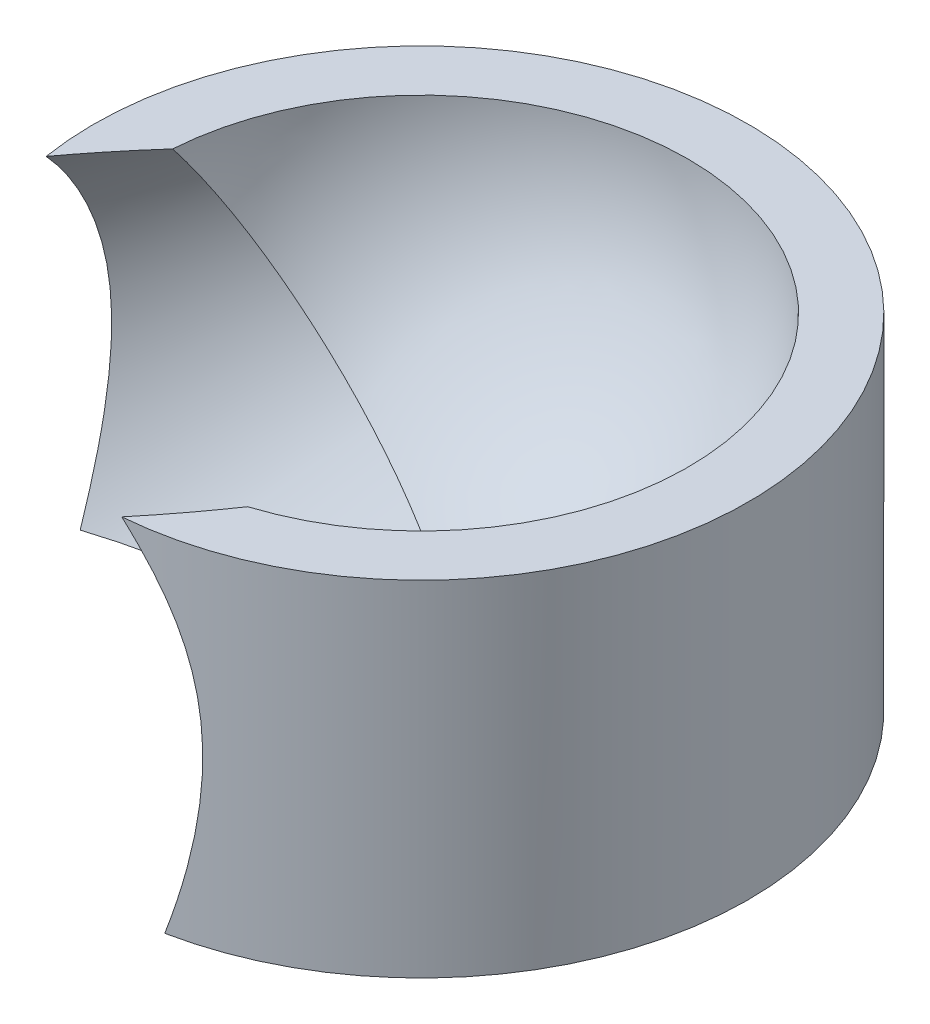
ISO-10303-21;
HEADER;
FILE_DESCRIPTION(('STEP AP214'),'2;1');
FILE_NAME('part.step','',(''),(''),'','','');
FILE_SCHEMA(('AUTOMOTIVE_DESIGN { 1 0 10303 214 1 1 1 1 }'));
ENDSEC;
DATA;
#1=APPLICATION_CONTEXT('core data for automotive mechanical design processes');
#2=APPLICATION_PROTOCOL_DEFINITION('international standard','automotive_design',2000,#1);
#3=PRODUCT_CONTEXT('',#1,'mechanical');
#4=PRODUCT('Part','Part','',(#3));
#5=PRODUCT_RELATED_PRODUCT_CATEGORY('part','',(#4));
#6=PRODUCT_DEFINITION_FORMATION('','',#4);
#7=PRODUCT_DEFINITION_CONTEXT('part definition',#1,'design');
#8=PRODUCT_DEFINITION('design','',#6,#7);
#9=PRODUCT_DEFINITION_SHAPE('','',#8);
#10=(LENGTH_UNIT() NAMED_UNIT(*) SI_UNIT(.MILLI.,.METRE.));
#11=(NAMED_UNIT(*) PLANE_ANGLE_UNIT() SI_UNIT($,.RADIAN.));
#12=(NAMED_UNIT(*) SI_UNIT($,.STERADIAN.) SOLID_ANGLE_UNIT());
#13=UNCERTAINTY_MEASURE_WITH_UNIT(LENGTH_MEASURE(1.E-05),#10,'distance_accuracy_value','');
#14=(GEOMETRIC_REPRESENTATION_CONTEXT(3) GLOBAL_UNCERTAINTY_ASSIGNED_CONTEXT((#13)) GLOBAL_UNIT_ASSIGNED_CONTEXT((#10,
#11,#12)) REPRESENTATION_CONTEXT('',''));
#15=CARTESIAN_POINT('',(0.,0.,0.));
#16=DIRECTION('',(0.,0.,1.));
#17=DIRECTION('',(1.,0.,0.));
#18=AXIS2_PLACEMENT_3D('',#15,#16,#17);
#19=CARTESIAN_POINT('',(-30.3108891324554,97.7,-15.));
#20=DIRECTION('',(0.,-1.,0.));
#21=DIRECTION('',(0.,0.,1.));
#22=AXIS2_PLACEMENT_3D('',#19,#20,#21);
#23=CYLINDRICAL_SURFACE('',#22,3.8);
#24=CARTESIAN_POINT('',(-30.3108891324554,97.,-15.));
#25=DIRECTION('',(0.,-1.,0.));
#26=DIRECTION('',(0.,0.,-1.));
#27=AXIS2_PLACEMENT_3D('',#24,#25,#26);
#28=CIRCLE('',#27,3.8);
#29=CARTESIAN_POINT('',(-34.1074748867385,97.,-14.8389515278731));
#30=VERTEX_POINT('',#29);
#31=CARTESIAN_POINT('',(-29.5615041608978,97.,-11.2746245606109));
#32=VERTEX_POINT('',#31);
#33=EDGE_CURVE('E47',#30,#32,#28,.T.);
#34=ORIENTED_EDGE('',*,*,#33,.F.);
#35=CARTESIAN_POINT('',(-34.0630424960343,101.0002,-14.3988800983306));
#36=CARTESIAN_POINT('',(-34.0718110950236,100.941314470494,-14.4535727451348));
#37=CARTESIAN_POINT('',(-34.0790221760432,100.880334472737,-14.5062811678693));
#38=CARTESIAN_POINT('',(-34.0908557219644,100.754374278326,-14.6070441904282));
#39=CARTESIAN_POINT('',(-34.0954772635486,100.689392664025,-14.655097125263));
#40=CARTESIAN_POINT('',(-34.1026321593722,100.556042110918,-14.7455647480082));
#41=CARTESIAN_POINT('',(-34.1051772884519,100.487694636403,-14.7880100685159));
#42=CARTESIAN_POINT('',(-34.1087664887118,100.347645833791,-14.8669930394829));
#43=CARTESIAN_POINT('',(-34.1098108736453,100.275945209957,-14.9035319233538));
#44=CARTESIAN_POINT('',(-34.1109217529916,100.129422236479,-14.970402087824));
#45=CARTESIAN_POINT('',(-34.1109851278273,100.054590686642,-15.0007132631708));
#46=CARTESIAN_POINT('',(-34.1105903971042,99.9025749564758,-15.0547990580072));
#47=CARTESIAN_POINT('',(-34.1101320842451,99.8253898527917,-15.0785710744027));
#48=CARTESIAN_POINT('',(-34.1090618616021,99.6693551529714,-15.1196080622126));
#49=CARTESIAN_POINT('',(-34.1084500210118,99.5905063212864,-15.1368759562337));
#50=CARTESIAN_POINT('',(-34.1073225352008,99.4316928256814,-15.1652013652592));
#51=CARTESIAN_POINT('',(-34.1068069187919,99.3517278352348,-15.1762570221539));
#52=CARTESIAN_POINT('',(-34.105844151858,99.1563821489884,-15.1961271026659));
#53=CARTESIAN_POINT('',(-34.105523751255,99.0406874090679,-15.2018883521968));
#54=CARTESIAN_POINT('',(-34.1054574020448,98.8092431130936,-15.2030801746675));
#55=CARTESIAN_POINT('',(-34.1057117891474,98.6934935645024,-15.1985047103584));
#56=CARTESIAN_POINT('',(-34.1066077120446,98.4621048722978,-15.180551636075));
#57=CARTESIAN_POINT('',(-34.1072512583088,98.3464694469417,-15.1671282836051));
#58=CARTESIAN_POINT('',(-34.1086049493334,98.1163673648676,-15.1328387347087));
#59=CARTESIAN_POINT('',(-34.109315079109,98.001900451573,-15.1119742099853));
#60=CARTESIAN_POINT('',(-34.1106104820581,97.7367003729433,-15.0560139292456));
#61=CARTESIAN_POINT('',(-34.1110770227965,97.5864778116717,-15.0184938633948));
#62=CARTESIAN_POINT('',(-34.1106868548476,97.3639688517672,-14.9556101110743));
#63=CARTESIAN_POINT('',(-34.1103798808479,97.2906762454686,-14.9336903207714));
#64=CARTESIAN_POINT('',(-34.1093014387462,97.14474722216,-14.8877902799355));
#65=CARTESIAN_POINT('',(-34.1085300015538,97.0721107618106,-14.8638101666064));
#66=CARTESIAN_POINT('',(-34.1074719611309,96.9998,-14.8388825738608));
#67=B_SPLINE_CURVE_WITH_KNOTS('',3,(#35,#36,#37,#38,#39,#40,#41,#42,#43,#44,#45,#46,#47,#48,#49,
#50,#51,#52,#53,#54,#55,#56,#57,#58,#59,#60,#61,#62,#63,#64,#65,#66),.UNSPECIFIED.,.F.,.F.,(4,2,
2,2,2,2,2,2,2,2,2,2,2,2,2,4),(0.,0.242487812446074,0.485062030598367,0.726250914982039,
0.967389367841488,1.20929447541561,1.45129574114893,1.69318813428323,1.93515284012405,
2.28209096716264,2.62923177885386,2.97818149210641,3.32705286107753,3.79116730720975,
4.020646080706,4.25010958426821),.UNSPECIFIED.);
#68=CARTESIAN_POINT('',(-34.0630722359518,101.,-14.3990657624698));
#69=VERTEX_POINT('',#68);
#70=EDGE_CURVE('E100',#69,#30,#67,.T.);
#71=ORIENTED_EDGE('',*,*,#70,.F.);
#72=CARTESIAN_POINT('',(-30.3108891324554,101.,-15.));
#73=DIRECTION('',(0.,-1.,0.));
#74=DIRECTION('',(0.,0.,-1.));
#75=AXIS2_PLACEMENT_3D('',#72,#73,#74);
#76=CIRCLE('',#75,3.8);
#77=CARTESIAN_POINT('',(-29.9992809717437,101.,-11.2127978197385));
#78=VERTEX_POINT('',#77);
#79=EDGE_CURVE('E84',#69,#78,#76,.T.);
#80=ORIENTED_EDGE('',*,*,#79,.T.);
#81=CARTESIAN_POINT('',(-29.5615718217302,96.9998,-11.2746109508069));
#82=CARTESIAN_POINT('',(-29.53763803957,97.0705546747354,-11.2794247462016));
#83=CARTESIAN_POINT('',(-29.5146500801677,97.1416227927385,-11.2842887533409));
#84=CARTESIAN_POINT('',(-29.4706900194513,97.2843968994103,-11.2939816546816));
#85=CARTESIAN_POINT('',(-29.4497183150889,97.3561030106608,-11.2988105417965));
#86=CARTESIAN_POINT('',(-29.3898726378823,97.5727136817751,-11.3130751591436));
#87=CARTESIAN_POINT('',(-29.3542565706601,97.7185595063866,-11.3222492231308));
#88=CARTESIAN_POINT('',(-29.2925498799048,98.0158920594205,-11.3388484808279));
#89=CARTESIAN_POINT('',(-29.2666970753927,98.1674313864205,-11.3462286182644));
#90=CARTESIAN_POINT('',(-29.2281326277631,98.4721704684842,-11.3574647994605));
#91=CARTESIAN_POINT('',(-29.2153985650956,98.6253669371334,-11.361326854209));
#92=CARTESIAN_POINT('',(-29.2081906977153,98.8659999089151,-11.3635109048227));
#93=CARTESIAN_POINT('',(-29.2082058948879,98.9532633070037,-11.3635051651497));
#94=CARTESIAN_POINT('',(-29.2141562776908,99.1275942839115,-11.3617048818101));
#95=CARTESIAN_POINT('',(-29.2200916228646,99.21466185739,-11.3599102899354));
#96=CARTESIAN_POINT('',(-29.2384728837583,99.3874862827804,-11.3544527278158));
#97=CARTESIAN_POINT('',(-29.25087590459,99.473247984399,-11.350802071296));
#98=CARTESIAN_POINT('',(-29.28271386022,99.6433678720104,-11.341703913024));
#99=CARTESIAN_POINT('',(-29.3021482085004,99.7277261744541,-11.3362565611463));
#100=CARTESIAN_POINT('',(-29.3486730087821,99.8952399752276,-11.3237619418322));
#101=CARTESIAN_POINT('',(-29.3758484243732,99.9783707074235,-11.3166971003957));
#102=CARTESIAN_POINT('',(-29.4378599705625,100.141642311545,-11.30150885241));
#103=CARTESIAN_POINT('',(-29.4726971532893,100.22178277107,-11.2933853005391));
#104=CARTESIAN_POINT('',(-29.5498590103042,100.378437216735,-11.276776971286));
#105=CARTESIAN_POINT('',(-29.5921916387963,100.454947239775,-11.268291817506));
#106=CARTESIAN_POINT('',(-29.6838301804554,100.603678553575,-11.2518058035735));
#107=CARTESIAN_POINT('',(-29.7331327845388,100.675901856539,-11.2438047161636));
#108=CARTESIAN_POINT('',(-29.8188734097495,100.790159616009,-11.2318373349568));
#109=CARTESIAN_POINT('',(-29.8534280990566,100.83358075225,-11.2274651122902));
#110=CARTESIAN_POINT('',(-29.9247889301809,100.918387540099,-11.2194954705612));
#111=CARTESIAN_POINT('',(-29.9615881491862,100.959778804244,-11.2158958098834));
#112=CARTESIAN_POINT('',(-29.999468369808,101.0002,-11.2127824054338));
#113=B_SPLINE_CURVE_WITH_KNOTS('',3,(#81,#82,#83,#84,#85,#86,#87,#88,#89,#90,#91,#92,#93,#94,
#95,#96,#97,#98,#99,#100,#101,#102,#103,#104,#105,#106,#107,#108,#109,#110,#111,#112),
.UNSPECIFIED.,.F.,.F.,(4,2,2,2,2,2,2,2,2,2,2,2,2,2,2,4),(0.,0.224529608607515,0.449103331512431,
0.899999438099035,1.36126182999433,1.82173462355426,2.08334352968175,2.34495948616094,
2.60486201655758,2.86474287218575,3.12759392537997,3.39048109634734,3.65364893503421,
3.91669224847533,4.08360469898824,4.25002609611653),.UNSPECIFIED.);
#114=EDGE_CURVE('E78',#32,#78,#113,.T.);
#115=ORIENTED_EDGE('',*,*,#114,.F.);
#116=EDGE_LOOP('',(#34,#71,#80,#115));
#117=FACE_BOUND('',#116,.T.);
#118=ADVANCED_FACE('F41',(#117),#23,.T.);
#119=CARTESIAN_POINT('',(-30.3108891324554,97.,-15.));
#120=DIRECTION('',(0.,1.,0.));
#121=DIRECTION('',(0.,0.,-1.));
#122=AXIS2_PLACEMENT_3D('',#119,#120,#121);
#123=PLANE('',#122);
#124=ORIENTED_EDGE('',*,*,#33,.T.);
#125=CARTESIAN_POINT('',(-37.139132571092,97.,-6.29120446410718));
#126=DIRECTION('',(0.,-1.,0.));
#127=DIRECTION('',(-0.617017715423195,0.,0.786949260660394));
#128=AXIS2_PLACEMENT_3D('',#125,#126,#127);
#129=ELLIPSE('',#128,10.5033012386468,5.02786274995613);
#130=EDGE_CURVE('E62',#30,#32,#129,.T.);
#131=ORIENTED_EDGE('',*,*,#130,.F.);
#132=EDGE_LOOP('',(#124,#131));
#133=FACE_BOUND('',#132,.T.);
#134=ADVANCED_FACE('F108',(#133),#123,.F.);
#135=CARTESIAN_POINT('',(-30.3108891324554,101.,-15.));
#136=DIRECTION('',(0.,1.,0.));
#137=DIRECTION('',(0.,0.,-1.));
#138=AXIS2_PLACEMENT_3D('',#135,#136,#137);
#139=PLANE('',#138);
#140=CARTESIAN_POINT('',(-31.835817099933,101.,-13.0550948431946));
#141=DIRECTION('',(0.,-1.,0.));
#142=DIRECTION('',(-0.617017715423195,0.,0.786949260660394));
#143=AXIS2_PLACEMENT_3D('',#140,#141,#142);
#144=ELLIPSE('',#143,5.40311255334571,2.58643522865266);
#145=CARTESIAN_POINT('',(-33.4038431098608,101.,-15.2088915834869));
#146=VERTEX_POINT('',#145);
#147=EDGE_CURVE('E85',#69,#146,#144,.T.);
#148=ORIENTED_EDGE('',*,*,#147,.T.);
#149=CARTESIAN_POINT('',(-30.3108891324554,101.,-15.));
#150=DIRECTION('',(0.,-1.,0.));
#151=DIRECTION('',(0.,0.,-1.));
#152=AXIS2_PLACEMENT_3D('',#149,#150,#151);
#153=CIRCLE('',#152,3.1);
#154=CARTESIAN_POINT('',(-29.3701180218789,101.,-12.0461974139248));
#155=VERTEX_POINT('',#154);
#156=EDGE_CURVE('E74',#146,#155,#153,.T.);
#157=ORIENTED_EDGE('',*,*,#156,.T.);
#158=EDGE_CURVE('E77',#155,#78,#144,.T.);
#159=ORIENTED_EDGE('',*,*,#158,.T.);
#160=ORIENTED_EDGE('',*,*,#79,.F.);
#161=EDGE_LOOP('',(#148,#157,#159,#160));
#162=FACE_BOUND('',#161,.T.);
#163=ADVANCED_FACE('F83',(#162),#139,.T.);
#164=CARTESIAN_POINT('',(-30.3108891324554,101.,-15.));
#165=DIRECTION('',(0.,0.,-1.));
#166=DIRECTION('',(-1.,0.,0.));
#167=AXIS2_PLACEMENT_3D('',#164,#165,#166);
#168=SPHERICAL_SURFACE('',#167,3.1);
#169=ORIENTED_EDGE('',*,*,#156,.F.);
#170=CARTESIAN_POINT('',(-31.0751548694972,100.208810505388,-14.0252494512242));
#171=DIRECTION('',(-0.51999029893439,-0.538308656109163,0.663199728416765));
#172=DIRECTION('',(0.,-0.776423951617283,-0.630210954645349));
#173=AXIS2_PLACEMENT_3D('',#170,#171,#172);
#174=CIRCLE('',#173,2.72942822482296);
#175=EDGE_CURVE('E11',#155,#146,#174,.F.);
#176=ORIENTED_EDGE('',*,*,#175,.F.);
#177=EDGE_LOOP('',(#169,#176));
#178=FACE_BOUND('',#177,.T.);
#179=ADVANCED_FACE('F75',(#178),#168,.F.);
#180=CARTESIAN_POINT('',(-30.3108891324553,101.,-15.));
#181=DIRECTION('',(-0.51999029893439,-0.538308656109163,0.663199728416765));
#182=DIRECTION('',(0.,0.776423951617283,0.630210954645349));
#183=AXIS2_PLACEMENT_3D('',#180,#181,#182);
#184=CONICAL_SURFACE('',#183,2.29999999999998,0.284261523704203);
#185=ORIENTED_EDGE('',*,*,#70,.T.);
#186=ORIENTED_EDGE('',*,*,#130,.T.);
#187=ORIENTED_EDGE('',*,*,#114,.T.);
#188=ORIENTED_EDGE('',*,*,#158,.F.);
#189=ORIENTED_EDGE('',*,*,#175,.T.);
#190=ORIENTED_EDGE('',*,*,#147,.F.);
#191=EDGE_LOOP('',(#185,#186,#187,#188,#189,#190));
#192=FACE_BOUND('',#191,.T.);
#193=ADVANCED_FACE('F80',(#192),#184,.F.);
#194=CLOSED_SHELL('',(#118,#134,#163,#179,#193));
#195=MANIFOLD_SOLID_BREP('B2',#194);
#196=ADVANCED_BREP_SHAPE_REPRESENTATION('',(#18,#195),#14);
#197=SHAPE_DEFINITION_REPRESENTATION(#9,#196);
ENDSEC;
END-ISO-10303-21;
